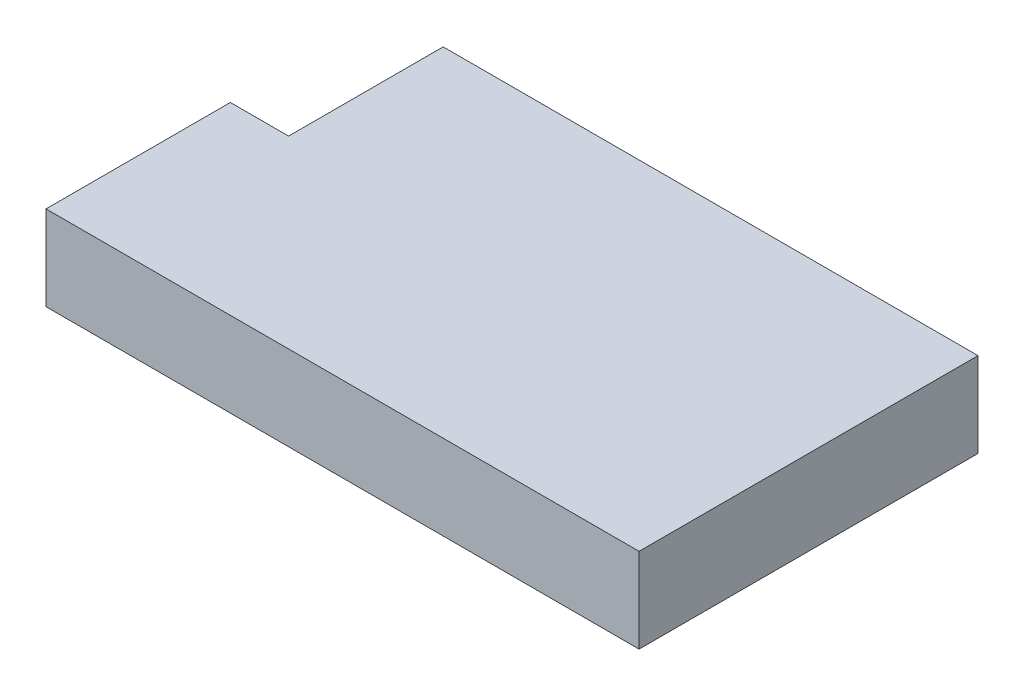
ISO-10303-21;
HEADER;
FILE_DESCRIPTION(('STEP AP214'),'2;1');
FILE_NAME('part.step','',(''),(''),'','','');
FILE_SCHEMA(('AUTOMOTIVE_DESIGN { 1 0 10303 214 1 1 1 1 }'));
ENDSEC;
DATA;
#1=APPLICATION_CONTEXT('core data for automotive mechanical design processes');
#2=APPLICATION_PROTOCOL_DEFINITION('international standard','automotive_design',2000,#1);
#3=PRODUCT_CONTEXT('',#1,'mechanical');
#4=PRODUCT('Part','Part','',(#3));
#5=PRODUCT_RELATED_PRODUCT_CATEGORY('part','',(#4));
#6=PRODUCT_DEFINITION_FORMATION('','',#4);
#7=PRODUCT_DEFINITION_CONTEXT('part definition',#1,'design');
#8=PRODUCT_DEFINITION('design','',#6,#7);
#9=PRODUCT_DEFINITION_SHAPE('','',#8);
#10=(LENGTH_UNIT() NAMED_UNIT(*) SI_UNIT(.MILLI.,.METRE.));
#11=(NAMED_UNIT(*) PLANE_ANGLE_UNIT() SI_UNIT($,.RADIAN.));
#12=(NAMED_UNIT(*) SI_UNIT($,.STERADIAN.) SOLID_ANGLE_UNIT());
#13=UNCERTAINTY_MEASURE_WITH_UNIT(LENGTH_MEASURE(1.E-05),#10,'distance_accuracy_value','');
#14=(GEOMETRIC_REPRESENTATION_CONTEXT(3) GLOBAL_UNCERTAINTY_ASSIGNED_CONTEXT((#13)) GLOBAL_UNIT_ASSIGNED_CONTEXT((#10,
#11,#12)) REPRESENTATION_CONTEXT('',''));
#15=CARTESIAN_POINT('',(0.,0.,0.));
#16=DIRECTION('',(0.,0.,1.));
#17=DIRECTION('',(1.,0.,0.));
#18=AXIS2_PLACEMENT_3D('',#15,#16,#17);
#19=CARTESIAN_POINT('',(105.,-30.,60.));
#20=DIRECTION('',(1.,0.,0.));
#21=DIRECTION('',(0.,0.,-1.));
#22=AXIS2_PLACEMENT_3D('',#19,#20,#21);
#23=PLANE('',#22);
#24=DIRECTION('',(0.,0.,-1.));
#25=VECTOR('',#24,1.);
#26=CARTESIAN_POINT('',(105.,0.,60.));
#27=LINE('',#26,#25);
#28=CARTESIAN_POINT('',(105.,0.,60.));
#29=VERTEX_POINT('',#28);
#30=CARTESIAN_POINT('',(105.,0.,-60.));
#31=VERTEX_POINT('',#30);
#32=EDGE_CURVE('E128',#29,#31,#27,.T.);
#33=ORIENTED_EDGE('',*,*,#32,.F.);
#34=DIRECTION('',(0.,1.,0.));
#35=VECTOR('',#34,1.);
#36=CARTESIAN_POINT('',(105.,-30.,60.));
#37=LINE('',#36,#35);
#38=CARTESIAN_POINT('',(105.,-30.,60.));
#39=VERTEX_POINT('',#38);
#40=EDGE_CURVE('E11',#39,#29,#37,.T.);
#41=ORIENTED_EDGE('',*,*,#40,.F.);
#42=DIRECTION('',(0.,0.,-1.));
#43=VECTOR('',#42,1.);
#44=CARTESIAN_POINT('',(105.,-30.,60.));
#45=LINE('',#44,#43);
#46=CARTESIAN_POINT('',(105.,-30.,-60.));
#47=VERTEX_POINT('',#46);
#48=EDGE_CURVE('E119',#39,#47,#45,.T.);
#49=ORIENTED_EDGE('',*,*,#48,.T.);
#50=DIRECTION('',(0.,1.,0.));
#51=VECTOR('',#50,1.);
#52=CARTESIAN_POINT('',(105.,-30.,-60.));
#53=LINE('',#52,#51);
#54=EDGE_CURVE('E42',#47,#31,#53,.T.);
#55=ORIENTED_EDGE('',*,*,#54,.T.);
#56=EDGE_LOOP('',(#33,#41,#49,#55));
#57=FACE_BOUND('',#56,.T.);
#58=ADVANCED_FACE('F39',(#57),#23,.T.);
#59=CARTESIAN_POINT('',(-105.,-30.,60.));
#60=DIRECTION('',(0.,0.,1.));
#61=DIRECTION('',(1.,0.,0.));
#62=AXIS2_PLACEMENT_3D('',#59,#60,#61);
#63=PLANE('',#62);
#64=DIRECTION('',(1.,0.,0.));
#65=VECTOR('',#64,1.);
#66=CARTESIAN_POINT('',(-105.,0.,60.));
#67=LINE('',#66,#65);
#68=CARTESIAN_POINT('',(-105.,0.,60.));
#69=VERTEX_POINT('',#68);
#70=EDGE_CURVE('E123',#69,#29,#67,.T.);
#71=ORIENTED_EDGE('',*,*,#70,.F.);
#72=DIRECTION('',(0.,1.,0.));
#73=VECTOR('',#72,1.);
#74=CARTESIAN_POINT('',(-105.,-30.,60.));
#75=LINE('',#74,#73);
#76=CARTESIAN_POINT('',(-105.,-30.,60.));
#77=VERTEX_POINT('',#76);
#78=EDGE_CURVE('E47',#77,#69,#75,.T.);
#79=ORIENTED_EDGE('',*,*,#78,.F.);
#80=DIRECTION('',(1.,0.,0.));
#81=VECTOR('',#80,1.);
#82=CARTESIAN_POINT('',(-105.,-30.,60.));
#83=LINE('',#82,#81);
#84=EDGE_CURVE('E121',#77,#39,#83,.T.);
#85=ORIENTED_EDGE('',*,*,#84,.T.);
#86=ORIENTED_EDGE('',*,*,#40,.T.);
#87=EDGE_LOOP('',(#71,#79,#85,#86));
#88=FACE_BOUND('',#87,.T.);
#89=ADVANCED_FACE('F142',(#88),#63,.T.);
#90=CARTESIAN_POINT('',(-105.,-30.,60.));
#91=DIRECTION('',(-1.,0.,0.));
#92=DIRECTION('',(0.,0.,1.));
#93=AXIS2_PLACEMENT_3D('',#90,#91,#92);
#94=PLANE('',#93);
#95=DIRECTION('',(0.,1.,0.));
#96=VECTOR('',#95,1.);
#97=CARTESIAN_POINT('',(-105.,-30.001,-5.26999599679681));
#98=LINE('',#97,#96);
#99=CARTESIAN_POINT('',(-105.,-30.,-5.26999599679681));
#100=VERTEX_POINT('',#99);
#101=CARTESIAN_POINT('',(-105.,0.,-5.26999599679681));
#102=VERTEX_POINT('',#101);
#103=EDGE_CURVE('E55',#100,#102,#98,.T.);
#104=ORIENTED_EDGE('',*,*,#103,.F.);
#105=DIRECTION('',(0.,0.,1.));
#106=VECTOR('',#105,1.);
#107=CARTESIAN_POINT('',(-105.,-30.,60.));
#108=LINE('',#107,#106);
#109=EDGE_CURVE('E118',#100,#77,#108,.T.);
#110=ORIENTED_EDGE('',*,*,#109,.T.);
#111=ORIENTED_EDGE('',*,*,#78,.T.);
#112=DIRECTION('',(0.,0.,1.));
#113=VECTOR('',#112,1.);
#114=CARTESIAN_POINT('',(-105.,0.,60.));
#115=LINE('',#114,#113);
#116=EDGE_CURVE('E133',#102,#69,#115,.T.);
#117=ORIENTED_EDGE('',*,*,#116,.F.);
#118=EDGE_LOOP('',(#104,#110,#111,#117));
#119=FACE_BOUND('',#118,.T.);
#120=ADVANCED_FACE('F144',(#119),#94,.T.);
#121=CARTESIAN_POINT('',(-105.,-30.,-60.));
#122=DIRECTION('',(0.,0.,-1.));
#123=DIRECTION('',(-1.,0.,0.));
#124=AXIS2_PLACEMENT_3D('',#121,#122,#123);
#125=PLANE('',#124);
#126=DIRECTION('',(0.,1.,0.));
#127=VECTOR('',#126,1.);
#128=CARTESIAN_POINT('',(-84.3674969975976,-30.001,-60.));
#129=LINE('',#128,#127);
#130=CARTESIAN_POINT('',(-84.3674969975976,-30.,-60.));
#131=VERTEX_POINT('',#130);
#132=CARTESIAN_POINT('',(-84.3674969975976,0.,-60.));
#133=VERTEX_POINT('',#132);
#134=EDGE_CURVE('E99',#131,#133,#129,.T.);
#135=ORIENTED_EDGE('',*,*,#134,.T.);
#136=DIRECTION('',(-1.,0.,0.));
#137=VECTOR('',#136,1.);
#138=CARTESIAN_POINT('',(-105.,0.,-60.));
#139=LINE('',#138,#137);
#140=EDGE_CURVE('E131',#31,#133,#139,.T.);
#141=ORIENTED_EDGE('',*,*,#140,.F.);
#142=ORIENTED_EDGE('',*,*,#54,.F.);
#143=DIRECTION('',(-1.,0.,0.));
#144=VECTOR('',#143,1.);
#145=CARTESIAN_POINT('',(-105.,-30.,-60.));
#146=LINE('',#145,#144);
#147=EDGE_CURVE('E113',#47,#131,#146,.T.);
#148=ORIENTED_EDGE('',*,*,#147,.T.);
#149=EDGE_LOOP('',(#135,#141,#142,#148));
#150=FACE_BOUND('',#149,.T.);
#151=ADVANCED_FACE('F117',(#150),#125,.T.);
#152=CARTESIAN_POINT('',(0.,-30.,0.));
#153=DIRECTION('',(0.,-1.,0.));
#154=DIRECTION('',(0.,0.,-1.));
#155=AXIS2_PLACEMENT_3D('',#152,#153,#154);
#156=PLANE('',#155);
#157=DIRECTION('',(0.,0.,-1.));
#158=VECTOR('',#157,1.);
#159=CARTESIAN_POINT('',(-84.3674969975976,-30.,-60.));
#160=LINE('',#159,#158);
#161=CARTESIAN_POINT('',(-84.3674969975976,-30.,-5.2699959967968));
#162=VERTEX_POINT('',#161);
#163=EDGE_CURVE('E102',#162,#131,#160,.T.);
#164=ORIENTED_EDGE('',*,*,#163,.T.);
#165=ORIENTED_EDGE('',*,*,#147,.F.);
#166=ORIENTED_EDGE('',*,*,#48,.F.);
#167=ORIENTED_EDGE('',*,*,#84,.F.);
#168=ORIENTED_EDGE('',*,*,#109,.F.);
#169=DIRECTION('',(1.,0.,0.));
#170=VECTOR('',#169,1.);
#171=CARTESIAN_POINT('',(-105.,-30.,-5.26999599679681));
#172=LINE('',#171,#170);
#173=EDGE_CURVE('E107',#100,#162,#172,.T.);
#174=ORIENTED_EDGE('',*,*,#173,.T.);
#175=EDGE_LOOP('',(#164,#165,#166,#167,#168,#174));
#176=FACE_BOUND('',#175,.T.);
#177=ADVANCED_FACE('F112',(#176),#156,.T.);
#178=CARTESIAN_POINT('',(0.,0.,0.));
#179=DIRECTION('',(0.,-1.,0.));
#180=DIRECTION('',(0.,0.,-1.));
#181=AXIS2_PLACEMENT_3D('',#178,#179,#180);
#182=PLANE('',#181);
#183=ORIENTED_EDGE('',*,*,#140,.T.);
#184=DIRECTION('',(0.,0.,-1.));
#185=VECTOR('',#184,1.);
#186=CARTESIAN_POINT('',(-84.3674969975976,0.,-60.));
#187=LINE('',#186,#185);
#188=CARTESIAN_POINT('',(-84.3674969975976,0.,-5.2699959967968));
#189=VERTEX_POINT('',#188);
#190=EDGE_CURVE('E105',#189,#133,#187,.T.);
#191=ORIENTED_EDGE('',*,*,#190,.F.);
#192=DIRECTION('',(1.,0.,0.));
#193=VECTOR('',#192,1.);
#194=CARTESIAN_POINT('',(-105.,0.,-5.26999599679681));
#195=LINE('',#194,#193);
#196=EDGE_CURVE('E115',#102,#189,#195,.T.);
#197=ORIENTED_EDGE('',*,*,#196,.F.);
#198=ORIENTED_EDGE('',*,*,#116,.T.);
#199=ORIENTED_EDGE('',*,*,#70,.T.);
#200=ORIENTED_EDGE('',*,*,#32,.T.);
#201=EDGE_LOOP('',(#183,#191,#197,#198,#199,#200));
#202=FACE_BOUND('',#201,.T.);
#203=ADVANCED_FACE('F141',(#202),#182,.F.);
#204=CARTESIAN_POINT('',(-84.3674969975976,-30.001,-60.));
#205=DIRECTION('',(1.,0.,0.));
#206=DIRECTION('',(0.,0.,-1.));
#207=AXIS2_PLACEMENT_3D('',#204,#205,#206);
#208=PLANE('',#207);
#209=DIRECTION('',(0.,1.,0.));
#210=VECTOR('',#209,1.);
#211=CARTESIAN_POINT('',(-84.3674969975976,-30.001,-5.2699959967968));
#212=LINE('',#211,#210);
#213=EDGE_CURVE('E108',#162,#189,#212,.T.);
#214=ORIENTED_EDGE('',*,*,#213,.T.);
#215=ORIENTED_EDGE('',*,*,#190,.T.);
#216=ORIENTED_EDGE('',*,*,#134,.F.);
#217=ORIENTED_EDGE('',*,*,#163,.F.);
#218=EDGE_LOOP('',(#214,#215,#216,#217));
#219=FACE_BOUND('',#218,.T.);
#220=ADVANCED_FACE('F101',(#219),#208,.F.);
#221=CARTESIAN_POINT('',(-105.,-30.001,-5.26999599679681));
#222=DIRECTION('',(0.,0.,1.));
#223=DIRECTION('',(1.,0.,0.));
#224=AXIS2_PLACEMENT_3D('',#221,#222,#223);
#225=PLANE('',#224);
#226=ORIENTED_EDGE('',*,*,#103,.T.);
#227=ORIENTED_EDGE('',*,*,#196,.T.);
#228=ORIENTED_EDGE('',*,*,#213,.F.);
#229=ORIENTED_EDGE('',*,*,#173,.F.);
#230=EDGE_LOOP('',(#226,#227,#228,#229));
#231=FACE_BOUND('',#230,.T.);
#232=ADVANCED_FACE('F149',(#231),#225,.F.);
#233=CLOSED_SHELL('',(#58,#89,#120,#151,#177,#203,#220,#232));
#234=MANIFOLD_SOLID_BREP('B2',#233);
#235=ADVANCED_BREP_SHAPE_REPRESENTATION('',(#18,#234),#14);
#236=SHAPE_DEFINITION_REPRESENTATION(#9,#235);
ENDSEC;
END-ISO-10303-21;
